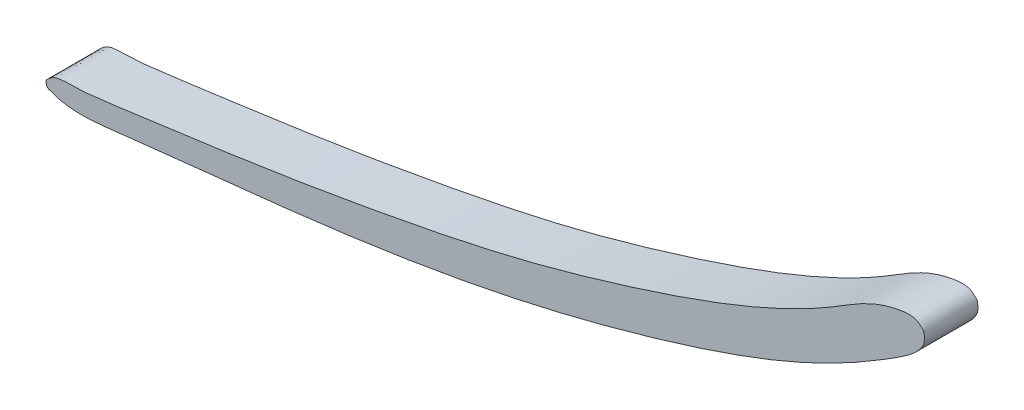
ISO-10303-21;
HEADER;
FILE_DESCRIPTION(('STEP AP214'),'2;1');
FILE_NAME('part.step','',(''),(''),'','','');
FILE_SCHEMA(('AUTOMOTIVE_DESIGN { 1 0 10303 214 1 1 1 1 }'));
ENDSEC;
DATA;
#1=APPLICATION_CONTEXT('core data for automotive mechanical design processes');
#2=APPLICATION_PROTOCOL_DEFINITION('international standard','automotive_design',2000,#1);
#3=PRODUCT_CONTEXT('',#1,'mechanical');
#4=PRODUCT('Part','Part','',(#3));
#5=PRODUCT_RELATED_PRODUCT_CATEGORY('part','',(#4));
#6=PRODUCT_DEFINITION_FORMATION('','',#4);
#7=PRODUCT_DEFINITION_CONTEXT('part definition',#1,'design');
#8=PRODUCT_DEFINITION('design','',#6,#7);
#9=PRODUCT_DEFINITION_SHAPE('','',#8);
#10=(LENGTH_UNIT() NAMED_UNIT(*) SI_UNIT(.MILLI.,.METRE.));
#11=(NAMED_UNIT(*) PLANE_ANGLE_UNIT() SI_UNIT($,.RADIAN.));
#12=(NAMED_UNIT(*) SI_UNIT($,.STERADIAN.) SOLID_ANGLE_UNIT());
#13=UNCERTAINTY_MEASURE_WITH_UNIT(LENGTH_MEASURE(1.E-05),#10,'distance_accuracy_value','');
#14=(GEOMETRIC_REPRESENTATION_CONTEXT(3) GLOBAL_UNCERTAINTY_ASSIGNED_CONTEXT((#13)) GLOBAL_UNIT_ASSIGNED_CONTEXT((#10,
#11,#12)) REPRESENTATION_CONTEXT('',''));
#15=CARTESIAN_POINT('',(0.,0.,0.));
#16=DIRECTION('',(0.,0.,1.));
#17=DIRECTION('',(1.,0.,0.));
#18=AXIS2_PLACEMENT_3D('',#15,#16,#17);
#19=CARTESIAN_POINT('',(78.7319450195708,0.,332.));
#20=CARTESIAN_POINT('',(78.698592924395,0.0862961726355242,332.));
#21=CARTESIAN_POINT('',(78.6360279586941,0.154236271967225,332.));
#22=CARTESIAN_POINT('',(78.505947181583,0.282207246280975,332.));
#23=CARTESIAN_POINT('',(78.4371830752917,0.342145123711174,332.));
#24=CARTESIAN_POINT('',(78.2345743351538,0.525962735406238,332.));
#25=CARTESIAN_POINT('',(78.1002322713559,0.650880233318252,332.));
#26=CARTESIAN_POINT('',(77.8813767344495,0.811903280749025,332.));
#27=CARTESIAN_POINT('',(77.8060034391002,0.861615265914912,332.));
#28=CARTESIAN_POINT('',(77.6463740732828,0.946503816432809,332.));
#29=CARTESIAN_POINT('',(77.5616973632142,0.982235446058503,332.));
#30=CARTESIAN_POINT('',(77.3009768082406,1.06979566784857,332.));
#31=CARTESIAN_POINT('',(77.1226144195656,1.10143248763723,332.));
#32=CARTESIAN_POINT('',(76.7614522103238,1.13862340118952,332.));
#33=CARTESIAN_POINT('',(76.5781212676885,1.14341343368627,332.));
#34=CARTESIAN_POINT('',(76.2155234059892,1.13929984730761,332.));
#35=CARTESIAN_POINT('',(76.0351729109473,1.13005067001033,332.));
#36=CARTESIAN_POINT('',(75.4966709169138,1.08296928434782,332.));
#37=CARTESIAN_POINT('',(75.1408742620453,1.02727931132441,332.));
#38=CARTESIAN_POINT('',(74.0780947419602,0.825246469483427,332.));
#39=CARTESIAN_POINT('',(73.3753749094688,0.638425038379013,332.));
#40=CARTESIAN_POINT('',(72.0113611039975,0.194251143162508,332.));
#41=CARTESIAN_POINT('',(71.3465255762792,-0.0665994178270982,332.));
#42=CARTESIAN_POINT('',(69.4022336988609,-0.962508559779454,332.));
#43=CARTESIAN_POINT('',(68.1686561192179,-1.70123520839468,332.));
#44=CARTESIAN_POINT('',(66.3270541886306,-2.82873293397266,332.));
#45=CARTESIAN_POINT('',(65.7140969273548,-3.20659206641776,332.));
#46=CARTESIAN_POINT('',(64.4815176145269,-3.94746873458233,332.));
#47=CARTESIAN_POINT('',(63.8625001466097,-4.31183259721172,332.));
#48=CARTESIAN_POINT('',(61.9904140490585,-5.37144615932192,332.));
#49=CARTESIAN_POINT('',(60.7227402165332,-6.03417202498053,332.));
#50=CARTESIAN_POINT('',(58.161854870259,-7.30275475512636,332.));
#51=CARTESIAN_POINT('',(56.8687725271582,-7.90889926537447,332.));
#52=CARTESIAN_POINT('',(54.2638320409681,-9.07937709000703,332.));
#53=CARTESIAN_POINT('',(52.9515375342118,-9.6427386808562,332.));
#54=CARTESIAN_POINT('',(50.3072754416256,-10.7256525461531,332.));
#55=CARTESIAN_POINT('',(48.9756382530983,-11.2459405712132,332.));
#56=CARTESIAN_POINT('',(44.9586602219631,-12.7576655783465,332.));
#57=CARTESIAN_POINT('',(42.2515285705043,-13.7014353645812,332.));
#58=CARTESIAN_POINT('',(36.8044857123461,-15.5124423138328,332.));
#59=CARTESIAN_POINT('',(34.0671229755587,-16.3757109911532,332.));
#60=CARTESIAN_POINT('',(28.5711706955289,-18.0306425171144,332.));
#61=CARTESIAN_POINT('',(25.813644780726,-18.823744710811,332.));
#62=CARTESIAN_POINT('',(20.2725486245057,-20.3162321214219,332.));
#63=CARTESIAN_POINT('',(17.4877869658497,-21.0149126647981,332.));
#64=CARTESIAN_POINT('',(11.8965223326884,-22.3092605239586,332.));
#65=CARTESIAN_POINT('',(9.09018813441748,-22.907110872046,332.));
#66=CARTESIAN_POINT('',(3.46422329984577,-24.0415300138458,332.));
#67=CARTESIAN_POINT('',(0.644735344651545,-24.5787880267674,332.));
#68=CARTESIAN_POINT('',(-4.9996227121521,-25.6196102546238,332.));
#69=CARTESIAN_POINT('',(-7.82527413212353,-26.1207998463998,332.));
#70=CARTESIAN_POINT('',(-13.4847421317255,-27.0779805567612,332.));
#71=CARTESIAN_POINT('',(-16.318465361412,-27.532360075278,332.));
#72=CARTESIAN_POINT('',(-21.9924902792767,-28.3963919981597,332.));
#73=CARTESIAN_POINT('',(-24.8328013856425,-28.8070055274834,332.));
#74=CARTESIAN_POINT('',(-30.5169156303883,-29.6045967422998,332.));
#75=CARTESIAN_POINT('',(-33.3602982576042,-29.9939013469119,332.));
#76=CARTESIAN_POINT('',(-37.626094764206,-30.5724554997542,332.));
#77=CARTESIAN_POINT('',(-39.0481332553724,-30.7645420230119,332.));
#78=CARTESIAN_POINT('',(-41.1820413064443,-31.0462533449841,332.));
#79=CARTESIAN_POINT('',(-41.8934772201922,-31.1391704658693,332.));
#80=CARTESIAN_POINT('',(-43.3165424623874,-31.3234264120956,332.));
#81=CARTESIAN_POINT('',(-44.0278968804641,-31.4169902091609,332.));
#82=CARTESIAN_POINT('',(-45.452982053534,-31.5849710938434,332.));
#83=CARTESIAN_POINT('',(-46.1671208971953,-31.6571820272252,332.));
#84=CARTESIAN_POINT('',(-47.2398259235487,-31.7308019727612,332.));
#85=CARTESIAN_POINT('',(-47.5976940412823,-31.7499256941533,332.));
#86=CARTESIAN_POINT('',(-48.3141062699283,-31.7759594846969,332.));
#87=CARTESIAN_POINT('',(-48.6727881808851,-31.78037982189,332.));
#88=CARTESIAN_POINT('',(-49.3897182017619,-31.7970582898689,332.));
#89=CARTESIAN_POINT('',(-49.7479114362279,-31.8108837347834,332.));
#90=CARTESIAN_POINT('',(-50.4582817055487,-31.8798119488284,332.));
#91=CARTESIAN_POINT('',(-50.8111044326501,-31.9315127683302,332.));
#92=CARTESIAN_POINT('',(-51.327525452678,-32.1025513442067,332.));
#93=CARTESIAN_POINT('',(-51.492473237249,-32.1750178008977,332.));
#94=CARTESIAN_POINT('',(-51.8010526664991,-32.3556658260121,332.));
#95=CARTESIAN_POINT('',(-51.9473616764412,-32.4612172239568,332.));
#96=CARTESIAN_POINT('',(-52.1577943280416,-32.6324854893259,332.));
#97=CARTESIAN_POINT('',(-52.2269957264221,-32.6907028770524,332.));
#98=CARTESIAN_POINT('',(-52.3627040876062,-32.810361210931,332.));
#99=CARTESIAN_POINT('',(-52.42917039923,-32.8715125446625,332.));
#100=CARTESIAN_POINT('',(-52.5129486427516,-32.9771822301,332.));
#101=CARTESIAN_POINT('',(-52.5382150952655,-33.0159916562963,332.));
#102=CARTESIAN_POINT('',(-52.5742038564087,-33.1002646333232,332.));
#103=CARTESIAN_POINT('',(-52.5840826913572,-33.1453364060187,332.));
#104=CARTESIAN_POINT('',(-52.5953809556758,-33.2827418290005,332.));
#105=CARTESIAN_POINT('',(-52.5800353420809,-33.3737946179991,332.));
#106=CARTESIAN_POINT('',(-52.5404365745839,-33.5523293866487,332.));
#107=CARTESIAN_POINT('',(-52.5158965476891,-33.6402154355629,332.));
#108=CARTESIAN_POINT('',(-52.46345501915,-33.7674897834462,332.));
#109=CARTESIAN_POINT('',(-52.4429882515677,-33.8089010992169,332.));
#110=CARTESIAN_POINT('',(-52.3921000333844,-33.8845646112999,332.));
#111=CARTESIAN_POINT('',(-52.3608153467589,-33.9195226952143,332.));
#112=CARTESIAN_POINT('',(-52.2555404759611,-34.006496080695,332.));
#113=CARTESIAN_POINT('',(-52.1673330062429,-34.0394227619844,332.));
#114=CARTESIAN_POINT('',(-51.9923830180372,-34.0941747173135,332.));
#115=CARTESIAN_POINT('',(-51.9041205444647,-34.119163644491,332.));
#116=CARTESIAN_POINT('',(-51.4672856641689,-34.2576806835825,332.));
#117=CARTESIAN_POINT('',(-51.1261572067783,-34.3976626279226,332.));
#118=CARTESIAN_POINT('',(-50.4246158367771,-34.6000952201043,332.));
#119=CARTESIAN_POINT('',(-50.066539375179,-34.6698350095753,332.));
#120=CARTESIAN_POINT('',(-49.3432358356563,-34.7785065807542,332.));
#121=CARTESIAN_POINT('',(-48.9770860612718,-34.8182148389236,332.));
#122=CARTESIAN_POINT('',(-47.1536933302241,-34.9579654487765,332.));
#123=CARTESIAN_POINT('',(-45.7063411553669,-34.8680509132502,332.));
#124=CARTESIAN_POINT('',(-43.5389774140063,-34.6681211734338,332.));
#125=CARTESIAN_POINT('',(-42.8172626355373,-34.5883438796928,332.));
#126=CARTESIAN_POINT('',(-41.3741691079069,-34.4228236083458,332.));
#127=CARTESIAN_POINT('',(-40.6528279228595,-34.3362707913582,332.));
#128=CARTESIAN_POINT('',(-38.4888802314072,-34.0766286492981,332.));
#129=CARTESIAN_POINT('',(-37.0459873678075,-33.9058183576239,332.));
#130=CARTESIAN_POINT('',(-32.714679181275,-33.4163975868789,332.));
#131=CARTESIAN_POINT('',(-29.8240776067787,-33.1170411014198,332.));
#132=CARTESIAN_POINT('',(-24.0433605336826,-32.5147424168514,332.));
#133=CARTESIAN_POINT('',(-21.1533089995997,-32.2107485584869,332.));
#134=CARTESIAN_POINT('',(-15.3777463894629,-31.5606914535981,332.));
#135=CARTESIAN_POINT('',(-12.4920294192304,-31.2161509726856,332.));
#136=CARTESIAN_POINT('',(-6.72892766000135,-30.4689772710302,332.));
#137=CARTESIAN_POINT('',(-3.85141469354719,-30.0658451742263,332.));
#138=CARTESIAN_POINT('',(4.76751949890646,-28.7569037979998,332.));
#139=CARTESIAN_POINT('',(10.4913150536816,-27.7471518071119,332.));
#140=CARTESIAN_POINT('',(21.8700769819089,-25.3730394373233,332.));
#141=CARTESIAN_POINT('',(27.5188285353269,-24.0043939278672,332.));
#142=CARTESIAN_POINT('',(35.9277061778924,-21.7033455107847,332.));
#143=CARTESIAN_POINT('',(38.7190720568369,-20.8946545547805,332.));
#144=CARTESIAN_POINT('',(44.2726305012966,-19.1882793343087,332.));
#145=CARTESIAN_POINT('',(47.035468418779,-18.29060789712,332.));
#146=CARTESIAN_POINT('',(52.519793857239,-16.3633244392833,332.));
#147=CARTESIAN_POINT('',(55.2379906738963,-15.3348106274954,332.));
#148=CARTESIAN_POINT('',(60.5943457738799,-13.0812998994576,332.));
#149=CARTESIAN_POINT('',(63.2323765300433,-11.8541412724745,332.));
#150=CARTESIAN_POINT('',(68.3892883800688,-9.17053763751624,332.));
#151=CARTESIAN_POINT('',(70.909693606343,-7.71590273622422,332.));
#152=CARTESIAN_POINT('',(73.9927741895663,-5.79149360063517,332.));
#153=CARTESIAN_POINT('',(74.606322830112,-5.40133469653858,332.));
#154=CARTESIAN_POINT('',(75.5133096111987,-4.79647289076586,332.));
#155=CARTESIAN_POINT('',(75.812917316275,-4.5908057392047,332.));
#156=CARTESIAN_POINT('',(76.4027355738621,-4.16549755046525,332.));
#157=CARTESIAN_POINT('',(76.6929002296196,-3.94704493033955,332.));
#158=CARTESIAN_POINT('',(77.2512976905918,-3.4854968041577,332.));
#159=CARTESIAN_POINT('',(77.5196053225075,-3.24230223222017,332.));
#160=CARTESIAN_POINT('',(78.0181310575056,-2.71247474034212,332.));
#161=CARTESIAN_POINT('',(78.2461861907169,-2.42463389558798,332.));
#162=CARTESIAN_POINT('',(78.5282337647369,-1.95796453751743,332.));
#163=CARTESIAN_POINT('',(78.6138935827237,-1.79460321394992,332.));
#164=CARTESIAN_POINT('',(78.7480296997088,-1.45612442338281,332.));
#165=CARTESIAN_POINT('',(78.7976285856701,-1.28194848524909,332.));
#166=CARTESIAN_POINT('',(78.830070167335,-0.914732247024508,332.));
#167=CARTESIAN_POINT('',(78.8080201696052,-0.730244943368698,332.));
#168=CARTESIAN_POINT('',(78.7797829219355,-0.455439766634505,332.));
#169=CARTESIAN_POINT('',(78.7743791838306,-0.363604698540503,332.));
#170=CARTESIAN_POINT('',(78.7659416187101,-0.179796611375714,332.));
#171=CARTESIAN_POINT('',(78.7652971147467,-0.0862961726355097,332.));
#172=CARTESIAN_POINT('',(78.7319450195708,0.,332.));
#173=B_SPLINE_CURVE_WITH_KNOTS('',3,(#19,#20,#21,#22,#23,#24,#25,#26,#27,#28,#29,#30,#31,#32,
#33,#34,#35,#36,#37,#38,#39,#40,#41,#42,#43,#44,#45,#46,#47,#48,#49,#50,#51,#52,#53,#54,#55,#56,
#57,#58,#59,#60,#61,#62,#63,#64,#65,#66,#67,#68,#69,#70,#71,#72,#73,#74,#75,#76,#77,#78,#79,#80,
#81,#82,#83,#84,#85,#86,#87,#88,#89,#90,#91,#92,#93,#94,#95,#96,#97,#98,#99,#100,#101,#102,#103,
#104,#105,#106,#107,#108,#109,#110,#111,#112,#113,#114,#115,#116,#117,#118,#119,#120,#121,#122,
#123,#124,#125,#126,#127,#128,#129,#130,#131,#132,#133,#134,#135,#136,#137,#138,#139,#140,#141,
#142,#143,#144,#145,#146,#147,#148,#149,#150,#151,#152,#153,#154,#155,#156,#157,#158,#159,#160,
#161,#162,#163,#164,#165,#166,#167,#168,#169,#170,#171,#172),.UNSPECIFIED.,.T.,.F.,(4,2,2,2,2,2,
2,2,2,2,2,2,2,2,2,2,2,2,2,2,2,2,2,2,2,2,2,2,2,2,2,2,2,2,2,2,2,2,2,2,2,2,2,2,2,2,2,2,2,2,2,2,2,2,
2,2,2,2,2,2,2,2,2,2,2,2,2,2,2,2,2,2,2,2,2,2,4),(0.,0.000976562499999942,0.00195312499999988,
0.00390624999999977,0.00488281249999977,0.00585937499999977,0.00781249999999977,
0.00976562499999978,0.0117187499999998,0.0156249999999996,0.0234374999999995,0.0312499999999994,
0.0468749999999991,0.054687499999999,0.0624999999999989,0.0781249999999989,0.0937499999999989,
0.109374999999999,0.124999999999999,0.156249999999999,0.187499999999999,0.218749999999999,
0.249999999999999,0.281249999999999,0.312499999999999,0.343749999999999,0.374999999999999,
0.406249999999999,0.437499999999999,0.453124999999999,0.460937499999999,0.468749999999999,
0.476562499999999,0.480468749999999,0.484375,0.48828125,0.4921875,0.494140625,0.49609375,
0.4970703125,0.498046875,0.49853515625,0.4990234375,0.5,0.5009765625,0.50146484375,0.501953125,
0.5029296875,0.50390625,0.5078125,0.51171875,0.515625,0.53125,0.5390625,0.546875,0.5625,0.59375,
0.625,0.65625,0.6875,0.75,0.8125,0.84375,0.875,0.90625,0.9375,0.96875,0.9765625,0.98046875,
0.984375,0.98828125,0.9921875,0.994140625,0.99609375,0.998046875,0.9990234375,1.),.UNSPECIFIED.);
#174=DIRECTION('',(0.,0.,-1.));
#175=VECTOR('',#174,1.);
#176=SURFACE_OF_LINEAR_EXTRUSION('',#173,#175);
#177=CARTESIAN_POINT('',(78.7319450195708,0.,332.));
#178=CARTESIAN_POINT('',(78.7652971147467,-0.0862961726355097,332.));
#179=CARTESIAN_POINT('',(78.7659416187101,-0.179796611375714,332.));
#180=CARTESIAN_POINT('',(78.7743791838306,-0.363604698540503,332.));
#181=CARTESIAN_POINT('',(78.7797829219355,-0.455439766634505,332.));
#182=CARTESIAN_POINT('',(78.8080201696052,-0.730244943368698,332.));
#183=CARTESIAN_POINT('',(78.830070167335,-0.914732247024508,332.));
#184=CARTESIAN_POINT('',(78.7976285856701,-1.28194848524909,332.));
#185=CARTESIAN_POINT('',(78.7480296997088,-1.45612442338281,332.));
#186=CARTESIAN_POINT('',(78.6138935827237,-1.79460321394992,332.));
#187=CARTESIAN_POINT('',(78.5282337647369,-1.95796453751743,332.));
#188=CARTESIAN_POINT('',(78.2461861907169,-2.42463389558798,332.));
#189=CARTESIAN_POINT('',(78.0181310575056,-2.71247474034212,332.));
#190=CARTESIAN_POINT('',(77.5196053225075,-3.24230223222017,332.));
#191=CARTESIAN_POINT('',(77.2512976905918,-3.4854968041577,332.));
#192=CARTESIAN_POINT('',(76.6929002296196,-3.94704493033955,332.));
#193=CARTESIAN_POINT('',(76.4027355738621,-4.16549755046525,332.));
#194=CARTESIAN_POINT('',(75.812917316275,-4.5908057392047,332.));
#195=CARTESIAN_POINT('',(75.5133096111987,-4.79647289076586,332.));
#196=CARTESIAN_POINT('',(74.606322830112,-5.40133469653858,332.));
#197=CARTESIAN_POINT('',(73.9927741895663,-5.79149360063517,332.));
#198=CARTESIAN_POINT('',(70.909693606343,-7.71590273622422,332.));
#199=CARTESIAN_POINT('',(68.3892883800688,-9.17053763751624,332.));
#200=CARTESIAN_POINT('',(63.2323765300433,-11.8541412724745,332.));
#201=CARTESIAN_POINT('',(60.5943457738799,-13.0812998994576,332.));
#202=CARTESIAN_POINT('',(55.2379906738963,-15.3348106274954,332.));
#203=CARTESIAN_POINT('',(52.519793857239,-16.3633244392833,332.));
#204=CARTESIAN_POINT('',(47.035468418779,-18.29060789712,332.));
#205=CARTESIAN_POINT('',(44.2726305012966,-19.1882793343087,332.));
#206=CARTESIAN_POINT('',(38.7190720568369,-20.8946545547805,332.));
#207=CARTESIAN_POINT('',(35.9277061778924,-21.7033455107847,332.));
#208=CARTESIAN_POINT('',(27.5188285353269,-24.0043939278672,332.));
#209=CARTESIAN_POINT('',(21.8700769819089,-25.3730394373233,332.));
#210=CARTESIAN_POINT('',(10.4913150536816,-27.7471518071119,332.));
#211=CARTESIAN_POINT('',(4.76751949890646,-28.7569037979998,332.));
#212=CARTESIAN_POINT('',(-3.85141469354719,-30.0658451742263,332.));
#213=CARTESIAN_POINT('',(-6.72892766000135,-30.4689772710302,332.));
#214=CARTESIAN_POINT('',(-12.4920294192304,-31.2161509726856,332.));
#215=CARTESIAN_POINT('',(-15.3777463894629,-31.5606914535981,332.));
#216=CARTESIAN_POINT('',(-21.1533089995997,-32.2107485584869,332.));
#217=CARTESIAN_POINT('',(-24.0433605336826,-32.5147424168514,332.));
#218=CARTESIAN_POINT('',(-29.8240776067787,-33.1170411014198,332.));
#219=CARTESIAN_POINT('',(-32.714679181275,-33.4163975868789,332.));
#220=CARTESIAN_POINT('',(-37.0459873678075,-33.9058183576239,332.));
#221=CARTESIAN_POINT('',(-38.4888802314072,-34.0766286492981,332.));
#222=CARTESIAN_POINT('',(-40.6528279228595,-34.3362707913582,332.));
#223=CARTESIAN_POINT('',(-41.3741691079069,-34.4228236083458,332.));
#224=CARTESIAN_POINT('',(-42.8172626355373,-34.5883438796928,332.));
#225=CARTESIAN_POINT('',(-43.5389774140063,-34.6681211734338,332.));
#226=CARTESIAN_POINT('',(-45.7063411553669,-34.8680509132502,332.));
#227=CARTESIAN_POINT('',(-47.1536933302241,-34.9579654487765,332.));
#228=CARTESIAN_POINT('',(-48.9770860612718,-34.8182148389236,332.));
#229=CARTESIAN_POINT('',(-49.3432358356563,-34.7785065807542,332.));
#230=CARTESIAN_POINT('',(-50.066539375179,-34.6698350095753,332.));
#231=CARTESIAN_POINT('',(-50.4246158367771,-34.6000952201043,332.));
#232=CARTESIAN_POINT('',(-51.1261572067783,-34.3976626279226,332.));
#233=CARTESIAN_POINT('',(-51.4672856641689,-34.2576806835825,332.));
#234=CARTESIAN_POINT('',(-51.9041205444647,-34.119163644491,332.));
#235=CARTESIAN_POINT('',(-51.9923830180372,-34.0941747173135,332.));
#236=CARTESIAN_POINT('',(-52.1673330062429,-34.0394227619844,332.));
#237=CARTESIAN_POINT('',(-52.2555404759611,-34.006496080695,332.));
#238=CARTESIAN_POINT('',(-52.3608153467589,-33.9195226952143,332.));
#239=CARTESIAN_POINT('',(-52.3921000333844,-33.8845646112999,332.));
#240=CARTESIAN_POINT('',(-52.4429882515677,-33.8089010992169,332.));
#241=CARTESIAN_POINT('',(-52.46345501915,-33.7674897834462,332.));
#242=CARTESIAN_POINT('',(-52.5158965476891,-33.6402154355629,332.));
#243=CARTESIAN_POINT('',(-52.5404365745839,-33.5523293866487,332.));
#244=CARTESIAN_POINT('',(-52.5800353420809,-33.3737946179991,332.));
#245=CARTESIAN_POINT('',(-52.5953809556758,-33.2827418290005,332.));
#246=CARTESIAN_POINT('',(-52.5840826913572,-33.1453364060187,332.));
#247=CARTESIAN_POINT('',(-52.5742038564087,-33.1002646333232,332.));
#248=CARTESIAN_POINT('',(-52.5382150952655,-33.0159916562963,332.));
#249=CARTESIAN_POINT('',(-52.5129486427516,-32.9771822301,332.));
#250=CARTESIAN_POINT('',(-52.42917039923,-32.8715125446625,332.));
#251=CARTESIAN_POINT('',(-52.3627040876062,-32.810361210931,332.));
#252=CARTESIAN_POINT('',(-52.2269957264221,-32.6907028770524,332.));
#253=CARTESIAN_POINT('',(-52.1577943280416,-32.6324854893259,332.));
#254=CARTESIAN_POINT('',(-51.9473616764412,-32.4612172239568,332.));
#255=CARTESIAN_POINT('',(-51.8010526664991,-32.3556658260121,332.));
#256=CARTESIAN_POINT('',(-51.492473237249,-32.1750178008977,332.));
#257=CARTESIAN_POINT('',(-51.327525452678,-32.1025513442067,332.));
#258=CARTESIAN_POINT('',(-50.8111044326501,-31.9315127683302,332.));
#259=CARTESIAN_POINT('',(-50.4582817055487,-31.8798119488284,332.));
#260=CARTESIAN_POINT('',(-49.7479114362279,-31.8108837347834,332.));
#261=CARTESIAN_POINT('',(-49.3897182017619,-31.7970582898689,332.));
#262=CARTESIAN_POINT('',(-48.6727881808851,-31.78037982189,332.));
#263=CARTESIAN_POINT('',(-48.3141062699283,-31.7759594846969,332.));
#264=CARTESIAN_POINT('',(-47.5976940412823,-31.7499256941533,332.));
#265=CARTESIAN_POINT('',(-47.2398259235487,-31.7308019727612,332.));
#266=CARTESIAN_POINT('',(-46.1671208971953,-31.6571820272252,332.));
#267=CARTESIAN_POINT('',(-45.452982053534,-31.5849710938434,332.));
#268=CARTESIAN_POINT('',(-44.0278968804641,-31.4169902091609,332.));
#269=CARTESIAN_POINT('',(-43.3165424623874,-31.3234264120956,332.));
#270=CARTESIAN_POINT('',(-41.8934772201922,-31.1391704658693,332.));
#271=CARTESIAN_POINT('',(-41.1820413064443,-31.0462533449841,332.));
#272=CARTESIAN_POINT('',(-39.0481332553724,-30.7645420230119,332.));
#273=CARTESIAN_POINT('',(-37.626094764206,-30.5724554997542,332.));
#274=CARTESIAN_POINT('',(-33.3602982576042,-29.9939013469119,332.));
#275=CARTESIAN_POINT('',(-30.5169156303883,-29.6045967422998,332.));
#276=CARTESIAN_POINT('',(-24.8328013856425,-28.8070055274834,332.));
#277=CARTESIAN_POINT('',(-21.9924902792767,-28.3963919981597,332.));
#278=CARTESIAN_POINT('',(-16.318465361412,-27.532360075278,332.));
#279=CARTESIAN_POINT('',(-13.4847421317255,-27.0779805567612,332.));
#280=CARTESIAN_POINT('',(-7.82527413212353,-26.1207998463998,332.));
#281=CARTESIAN_POINT('',(-4.9996227121521,-25.6196102546238,332.));
#282=CARTESIAN_POINT('',(0.644735344651545,-24.5787880267674,332.));
#283=CARTESIAN_POINT('',(3.46422329984577,-24.0415300138458,332.));
#284=CARTESIAN_POINT('',(9.09018813441748,-22.907110872046,332.));
#285=CARTESIAN_POINT('',(11.8965223326884,-22.3092605239586,332.));
#286=CARTESIAN_POINT('',(17.4877869658497,-21.0149126647981,332.));
#287=CARTESIAN_POINT('',(20.2725486245057,-20.3162321214219,332.));
#288=CARTESIAN_POINT('',(25.813644780726,-18.823744710811,332.));
#289=CARTESIAN_POINT('',(28.5711706955289,-18.0306425171144,332.));
#290=CARTESIAN_POINT('',(34.0671229755587,-16.3757109911532,332.));
#291=CARTESIAN_POINT('',(36.8044857123461,-15.5124423138328,332.));
#292=CARTESIAN_POINT('',(42.2515285705043,-13.7014353645812,332.));
#293=CARTESIAN_POINT('',(44.9586602219631,-12.7576655783465,332.));
#294=CARTESIAN_POINT('',(48.9756382530983,-11.2459405712132,332.));
#295=CARTESIAN_POINT('',(50.3072754416256,-10.7256525461531,332.));
#296=CARTESIAN_POINT('',(52.9515375342118,-9.6427386808562,332.));
#297=CARTESIAN_POINT('',(54.2638320409681,-9.07937709000703,332.));
#298=CARTESIAN_POINT('',(56.8687725271582,-7.90889926537447,332.));
#299=CARTESIAN_POINT('',(58.161854870259,-7.30275475512636,332.));
#300=CARTESIAN_POINT('',(60.7227402165332,-6.03417202498053,332.));
#301=CARTESIAN_POINT('',(61.9904140490585,-5.37144615932192,332.));
#302=CARTESIAN_POINT('',(63.8625001466097,-4.31183259721172,332.));
#303=CARTESIAN_POINT('',(64.4815176145269,-3.94746873458233,332.));
#304=CARTESIAN_POINT('',(65.7140969273548,-3.20659206641776,332.));
#305=CARTESIAN_POINT('',(66.3270541886306,-2.82873293397266,332.));
#306=CARTESIAN_POINT('',(68.1686561192179,-1.70123520839468,332.));
#307=CARTESIAN_POINT('',(69.4022336988609,-0.962508559779454,332.));
#308=CARTESIAN_POINT('',(71.3465255762792,-0.0665994178270982,332.));
#309=CARTESIAN_POINT('',(72.0113611039975,0.194251143162508,332.));
#310=CARTESIAN_POINT('',(73.3753749094688,0.638425038379013,332.));
#311=CARTESIAN_POINT('',(74.0780947419602,0.825246469483427,332.));
#312=CARTESIAN_POINT('',(75.1408742620453,1.02727931132441,332.));
#313=CARTESIAN_POINT('',(75.4966709169138,1.08296928434782,332.));
#314=CARTESIAN_POINT('',(76.0351729109473,1.13005067001033,332.));
#315=CARTESIAN_POINT('',(76.2155234059892,1.13929984730761,332.));
#316=CARTESIAN_POINT('',(76.5781212676885,1.14341343368627,332.));
#317=CARTESIAN_POINT('',(76.7614522103238,1.13862340118952,332.));
#318=CARTESIAN_POINT('',(77.1226144195656,1.10143248763723,332.));
#319=CARTESIAN_POINT('',(77.3009768082406,1.06979566784857,332.));
#320=CARTESIAN_POINT('',(77.5616973632142,0.982235446058503,332.));
#321=CARTESIAN_POINT('',(77.6463740732828,0.946503816432809,332.));
#322=CARTESIAN_POINT('',(77.8060034391002,0.861615265914912,332.));
#323=CARTESIAN_POINT('',(77.8813767344495,0.811903280749025,332.));
#324=CARTESIAN_POINT('',(78.1002322713559,0.650880233318252,332.));
#325=CARTESIAN_POINT('',(78.2345743351538,0.525962735406238,332.));
#326=CARTESIAN_POINT('',(78.4371830752917,0.342145123711174,332.));
#327=CARTESIAN_POINT('',(78.505947181583,0.282207246280975,332.));
#328=CARTESIAN_POINT('',(78.6360279586941,0.154236271967225,332.));
#329=CARTESIAN_POINT('',(78.698592924395,0.0862961726355242,332.));
#330=CARTESIAN_POINT('',(78.7319450195708,0.,332.));
#331=B_SPLINE_CURVE_WITH_KNOTS('',3,(#177,#178,#179,#180,#181,#182,#183,#184,#185,#186,#187,
#188,#189,#190,#191,#192,#193,#194,#195,#196,#197,#198,#199,#200,#201,#202,#203,#204,#205,#206,
#207,#208,#209,#210,#211,#212,#213,#214,#215,#216,#217,#218,#219,#220,#221,#222,#223,#224,#225,
#226,#227,#228,#229,#230,#231,#232,#233,#234,#235,#236,#237,#238,#239,#240,#241,#242,#243,#244,
#245,#246,#247,#248,#249,#250,#251,#252,#253,#254,#255,#256,#257,#258,#259,#260,#261,#262,#263,
#264,#265,#266,#267,#268,#269,#270,#271,#272,#273,#274,#275,#276,#277,#278,#279,#280,#281,#282,
#283,#284,#285,#286,#287,#288,#289,#290,#291,#292,#293,#294,#295,#296,#297,#298,#299,#300,#301,
#302,#303,#304,#305,#306,#307,#308,#309,#310,#311,#312,#313,#314,#315,#316,#317,#318,#319,#320,
#321,#322,#323,#324,#325,#326,#327,#328,#329,#330),.UNSPECIFIED.,.T.,.F.,(4,2,2,2,2,2,2,2,2,2,2,
2,2,2,2,2,2,2,2,2,2,2,2,2,2,2,2,2,2,2,2,2,2,2,2,2,2,2,2,2,2,2,2,2,2,2,2,2,2,2,2,2,2,2,2,2,2,2,2,
2,2,2,2,2,2,2,2,2,2,2,2,2,2,2,2,2,4),(0.,0.000976562499999889,0.00195312499999989,
0.00390624999999989,0.00585937499999989,0.00781249999999989,0.0117187499999999,
0.0156249999999999,0.0195312499999998,0.0234374999999998,0.0312499999999998,0.0624999999999998,
0.0937499999999999,0.125,0.15625,0.1875,0.25,0.3125,0.34375,0.375,0.40625,0.4375,0.453125,
0.4609375,0.46875,0.484375,0.48828125,0.4921875,0.49609375,0.4970703125,0.498046875,
0.49853515625,0.4990234375,0.5,0.5009765625,0.50146484375,0.501953125,0.5029296875,0.50390625,
0.505859375,0.5078125,0.51171875,0.515625,0.519531250000001,0.523437500000001,0.531250000000001,
0.539062500000001,0.546875000000001,0.562500000000001,0.593750000000001,0.625000000000001,
0.656250000000001,0.687500000000001,0.718750000000001,0.750000000000001,0.781250000000001,
0.812500000000001,0.843750000000001,0.875000000000001,0.890625000000001,0.906250000000001,
0.921875000000001,0.937500000000001,0.945312500000001,0.953125000000001,0.968750000000001,
0.9765625,0.984375,0.98828125,0.990234375,0.9921875,0.994140625,0.9951171875,0.99609375,
0.998046875,0.9990234375,1.),.UNSPECIFIED.);
#332=CARTESIAN_POINT('',(78.7319450195708,0.,332.));
#333=VERTEX_POINT('',#332);
#334=EDGE_CURVE('E10',#333,#333,#331,.F.);
#335=ORIENTED_EDGE('',*,*,#334,.F.);
#336=EDGE_LOOP('',(#335));
#337=FACE_BOUND('',#336,.T.);
#338=CARTESIAN_POINT('',(78.7319450195708,0.,324.));
#339=CARTESIAN_POINT('',(78.698592924395,0.0862961726355242,324.));
#340=CARTESIAN_POINT('',(78.6360279586941,0.154236271967225,324.));
#341=CARTESIAN_POINT('',(78.505947181583,0.282207246280975,324.));
#342=CARTESIAN_POINT('',(78.4371830752917,0.342145123711174,324.));
#343=CARTESIAN_POINT('',(78.2345743351538,0.525962735406238,324.));
#344=CARTESIAN_POINT('',(78.1002322713559,0.650880233318252,324.));
#345=CARTESIAN_POINT('',(77.8813767344495,0.811903280749025,324.));
#346=CARTESIAN_POINT('',(77.8060034391002,0.861615265914912,324.));
#347=CARTESIAN_POINT('',(77.6463740732828,0.946503816432809,324.));
#348=CARTESIAN_POINT('',(77.5616973632142,0.982235446058503,324.));
#349=CARTESIAN_POINT('',(77.3009768082406,1.06979566784857,324.));
#350=CARTESIAN_POINT('',(77.1226144195656,1.10143248763723,324.));
#351=CARTESIAN_POINT('',(76.7614522103238,1.13862340118952,324.));
#352=CARTESIAN_POINT('',(76.5781212676885,1.14341343368627,324.));
#353=CARTESIAN_POINT('',(76.2155234059892,1.13929984730761,324.));
#354=CARTESIAN_POINT('',(76.0351729109473,1.13005067001033,324.));
#355=CARTESIAN_POINT('',(75.4966709169138,1.08296928434782,324.));
#356=CARTESIAN_POINT('',(75.1408742620453,1.02727931132441,324.));
#357=CARTESIAN_POINT('',(74.0780947419602,0.825246469483427,324.));
#358=CARTESIAN_POINT('',(73.3753749094688,0.638425038379013,324.));
#359=CARTESIAN_POINT('',(72.0113611039975,0.194251143162508,324.));
#360=CARTESIAN_POINT('',(71.3465255762792,-0.0665994178270982,324.));
#361=CARTESIAN_POINT('',(69.4022336988609,-0.962508559779454,324.));
#362=CARTESIAN_POINT('',(68.1686561192179,-1.70123520839468,324.));
#363=CARTESIAN_POINT('',(66.3270541886306,-2.82873293397266,324.));
#364=CARTESIAN_POINT('',(65.7140969273548,-3.20659206641776,324.));
#365=CARTESIAN_POINT('',(64.4815176145269,-3.94746873458233,324.));
#366=CARTESIAN_POINT('',(63.8625001466097,-4.31183259721172,324.));
#367=CARTESIAN_POINT('',(61.9904140490585,-5.37144615932192,324.));
#368=CARTESIAN_POINT('',(60.7227402165332,-6.03417202498053,324.));
#369=CARTESIAN_POINT('',(58.161854870259,-7.30275475512636,324.));
#370=CARTESIAN_POINT('',(56.8687725271582,-7.90889926537447,324.));
#371=CARTESIAN_POINT('',(54.2638320409681,-9.07937709000703,324.));
#372=CARTESIAN_POINT('',(52.9515375342118,-9.6427386808562,324.));
#373=CARTESIAN_POINT('',(50.3072754416256,-10.7256525461531,324.));
#374=CARTESIAN_POINT('',(48.9756382530983,-11.2459405712132,324.));
#375=CARTESIAN_POINT('',(44.9586602219631,-12.7576655783465,324.));
#376=CARTESIAN_POINT('',(42.2515285705043,-13.7014353645812,324.));
#377=CARTESIAN_POINT('',(36.8044857123461,-15.5124423138328,324.));
#378=CARTESIAN_POINT('',(34.0671229755587,-16.3757109911532,324.));
#379=CARTESIAN_POINT('',(28.5711706955289,-18.0306425171144,324.));
#380=CARTESIAN_POINT('',(25.813644780726,-18.823744710811,324.));
#381=CARTESIAN_POINT('',(20.2725486245057,-20.3162321214219,324.));
#382=CARTESIAN_POINT('',(17.4877869658497,-21.0149126647981,324.));
#383=CARTESIAN_POINT('',(11.8965223326884,-22.3092605239586,324.));
#384=CARTESIAN_POINT('',(9.09018813441748,-22.907110872046,324.));
#385=CARTESIAN_POINT('',(3.46422329984577,-24.0415300138458,324.));
#386=CARTESIAN_POINT('',(0.644735344651545,-24.5787880267674,324.));
#387=CARTESIAN_POINT('',(-4.9996227121521,-25.6196102546238,324.));
#388=CARTESIAN_POINT('',(-7.82527413212353,-26.1207998463998,324.));
#389=CARTESIAN_POINT('',(-13.4847421317255,-27.0779805567612,324.));
#390=CARTESIAN_POINT('',(-16.318465361412,-27.532360075278,324.));
#391=CARTESIAN_POINT('',(-21.9924902792767,-28.3963919981597,324.));
#392=CARTESIAN_POINT('',(-24.8328013856425,-28.8070055274834,324.));
#393=CARTESIAN_POINT('',(-30.5169156303883,-29.6045967422998,324.));
#394=CARTESIAN_POINT('',(-33.3602982576042,-29.9939013469119,324.));
#395=CARTESIAN_POINT('',(-37.626094764206,-30.5724554997542,324.));
#396=CARTESIAN_POINT('',(-39.0481332553724,-30.7645420230119,324.));
#397=CARTESIAN_POINT('',(-41.1820413064443,-31.0462533449841,324.));
#398=CARTESIAN_POINT('',(-41.8934772201922,-31.1391704658693,324.));
#399=CARTESIAN_POINT('',(-43.3165424623874,-31.3234264120956,324.));
#400=CARTESIAN_POINT('',(-44.0278968804641,-31.4169902091609,324.));
#401=CARTESIAN_POINT('',(-45.452982053534,-31.5849710938434,324.));
#402=CARTESIAN_POINT('',(-46.1671208971953,-31.6571820272252,324.));
#403=CARTESIAN_POINT('',(-47.2398259235487,-31.7308019727612,324.));
#404=CARTESIAN_POINT('',(-47.5976940412823,-31.7499256941533,324.));
#405=CARTESIAN_POINT('',(-48.3141062699283,-31.7759594846969,324.));
#406=CARTESIAN_POINT('',(-48.6727881808851,-31.78037982189,324.));
#407=CARTESIAN_POINT('',(-49.3897182017619,-31.7970582898689,324.));
#408=CARTESIAN_POINT('',(-49.7479114362279,-31.8108837347834,324.));
#409=CARTESIAN_POINT('',(-50.4582817055487,-31.8798119488284,324.));
#410=CARTESIAN_POINT('',(-50.8111044326501,-31.9315127683302,324.));
#411=CARTESIAN_POINT('',(-51.327525452678,-32.1025513442067,324.));
#412=CARTESIAN_POINT('',(-51.492473237249,-32.1750178008977,324.));
#413=CARTESIAN_POINT('',(-51.8010526664991,-32.3556658260121,324.));
#414=CARTESIAN_POINT('',(-51.9473616764412,-32.4612172239568,324.));
#415=CARTESIAN_POINT('',(-52.1577943280416,-32.6324854893259,324.));
#416=CARTESIAN_POINT('',(-52.2269957264221,-32.6907028770524,324.));
#417=CARTESIAN_POINT('',(-52.3627040876062,-32.810361210931,324.));
#418=CARTESIAN_POINT('',(-52.42917039923,-32.8715125446625,324.));
#419=CARTESIAN_POINT('',(-52.5129486427516,-32.9771822301,324.));
#420=CARTESIAN_POINT('',(-52.5382150952655,-33.0159916562963,324.));
#421=CARTESIAN_POINT('',(-52.5742038564087,-33.1002646333232,324.));
#422=CARTESIAN_POINT('',(-52.5840826913572,-33.1453364060187,324.));
#423=CARTESIAN_POINT('',(-52.5953809556758,-33.2827418290005,324.));
#424=CARTESIAN_POINT('',(-52.5800353420809,-33.3737946179991,324.));
#425=CARTESIAN_POINT('',(-52.5404365745839,-33.5523293866487,324.));
#426=CARTESIAN_POINT('',(-52.5158965476891,-33.6402154355629,324.));
#427=CARTESIAN_POINT('',(-52.46345501915,-33.7674897834462,324.));
#428=CARTESIAN_POINT('',(-52.4429882515677,-33.8089010992169,324.));
#429=CARTESIAN_POINT('',(-52.3921000333844,-33.8845646112999,324.));
#430=CARTESIAN_POINT('',(-52.3608153467589,-33.9195226952143,324.));
#431=CARTESIAN_POINT('',(-52.2555404759611,-34.006496080695,324.));
#432=CARTESIAN_POINT('',(-52.1673330062429,-34.0394227619844,324.));
#433=CARTESIAN_POINT('',(-51.9923830180372,-34.0941747173135,324.));
#434=CARTESIAN_POINT('',(-51.9041205444647,-34.119163644491,324.));
#435=CARTESIAN_POINT('',(-51.4672856641689,-34.2576806835825,324.));
#436=CARTESIAN_POINT('',(-51.1261572067783,-34.3976626279226,324.));
#437=CARTESIAN_POINT('',(-50.4246158367771,-34.6000952201043,324.));
#438=CARTESIAN_POINT('',(-50.066539375179,-34.6698350095753,324.));
#439=CARTESIAN_POINT('',(-49.3432358356563,-34.7785065807542,324.));
#440=CARTESIAN_POINT('',(-48.9770860612718,-34.8182148389236,324.));
#441=CARTESIAN_POINT('',(-47.1536933302241,-34.9579654487765,324.));
#442=CARTESIAN_POINT('',(-45.7063411553669,-34.8680509132502,324.));
#443=CARTESIAN_POINT('',(-43.5389774140063,-34.6681211734338,324.));
#444=CARTESIAN_POINT('',(-42.8172626355373,-34.5883438796928,324.));
#445=CARTESIAN_POINT('',(-41.3741691079069,-34.4228236083458,324.));
#446=CARTESIAN_POINT('',(-40.6528279228595,-34.3362707913582,324.));
#447=CARTESIAN_POINT('',(-38.4888802314072,-34.0766286492981,324.));
#448=CARTESIAN_POINT('',(-37.0459873678075,-33.9058183576239,324.));
#449=CARTESIAN_POINT('',(-32.714679181275,-33.4163975868789,324.));
#450=CARTESIAN_POINT('',(-29.8240776067787,-33.1170411014198,324.));
#451=CARTESIAN_POINT('',(-24.0433605336826,-32.5147424168514,324.));
#452=CARTESIAN_POINT('',(-21.1533089995997,-32.2107485584869,324.));
#453=CARTESIAN_POINT('',(-15.3777463894629,-31.5606914535981,324.));
#454=CARTESIAN_POINT('',(-12.4920294192304,-31.2161509726856,324.));
#455=CARTESIAN_POINT('',(-6.72892766000135,-30.4689772710302,324.));
#456=CARTESIAN_POINT('',(-3.85141469354719,-30.0658451742263,324.));
#457=CARTESIAN_POINT('',(4.76751949890646,-28.7569037979998,324.));
#458=CARTESIAN_POINT('',(10.4913150536816,-27.7471518071119,324.));
#459=CARTESIAN_POINT('',(21.8700769819089,-25.3730394373233,324.));
#460=CARTESIAN_POINT('',(27.5188285353269,-24.0043939278672,324.));
#461=CARTESIAN_POINT('',(35.9277061778924,-21.7033455107847,324.));
#462=CARTESIAN_POINT('',(38.7190720568369,-20.8946545547805,324.));
#463=CARTESIAN_POINT('',(44.2726305012966,-19.1882793343087,324.));
#464=CARTESIAN_POINT('',(47.035468418779,-18.29060789712,324.));
#465=CARTESIAN_POINT('',(52.519793857239,-16.3633244392833,324.));
#466=CARTESIAN_POINT('',(55.2379906738963,-15.3348106274954,324.));
#467=CARTESIAN_POINT('',(60.5943457738799,-13.0812998994576,324.));
#468=CARTESIAN_POINT('',(63.2323765300433,-11.8541412724745,324.));
#469=CARTESIAN_POINT('',(68.3892883800688,-9.17053763751624,324.));
#470=CARTESIAN_POINT('',(70.909693606343,-7.71590273622422,324.));
#471=CARTESIAN_POINT('',(73.9927741895663,-5.79149360063517,324.));
#472=CARTESIAN_POINT('',(74.606322830112,-5.40133469653858,324.));
#473=CARTESIAN_POINT('',(75.5133096111987,-4.79647289076586,324.));
#474=CARTESIAN_POINT('',(75.812917316275,-4.5908057392047,324.));
#475=CARTESIAN_POINT('',(76.4027355738621,-4.16549755046525,324.));
#476=CARTESIAN_POINT('',(76.6929002296196,-3.94704493033955,324.));
#477=CARTESIAN_POINT('',(77.2512976905918,-3.4854968041577,324.));
#478=CARTESIAN_POINT('',(77.5196053225075,-3.24230223222017,324.));
#479=CARTESIAN_POINT('',(78.0181310575056,-2.71247474034212,324.));
#480=CARTESIAN_POINT('',(78.2461861907169,-2.42463389558798,324.));
#481=CARTESIAN_POINT('',(78.5282337647369,-1.95796453751743,324.));
#482=CARTESIAN_POINT('',(78.6138935827237,-1.79460321394992,324.));
#483=CARTESIAN_POINT('',(78.7480296997088,-1.45612442338281,324.));
#484=CARTESIAN_POINT('',(78.7976285856701,-1.28194848524909,324.));
#485=CARTESIAN_POINT('',(78.830070167335,-0.914732247024508,324.));
#486=CARTESIAN_POINT('',(78.8080201696052,-0.730244943368698,324.));
#487=CARTESIAN_POINT('',(78.7797829219355,-0.455439766634505,324.));
#488=CARTESIAN_POINT('',(78.7743791838306,-0.363604698540503,324.));
#489=CARTESIAN_POINT('',(78.7659416187101,-0.179796611375714,324.));
#490=CARTESIAN_POINT('',(78.7652971147467,-0.0862961726355097,324.));
#491=CARTESIAN_POINT('',(78.7319450195708,0.,324.));
#492=B_SPLINE_CURVE_WITH_KNOTS('',3,(#338,#339,#340,#341,#342,#343,#344,#345,#346,#347,#348,
#349,#350,#351,#352,#353,#354,#355,#356,#357,#358,#359,#360,#361,#362,#363,#364,#365,#366,#367,
#368,#369,#370,#371,#372,#373,#374,#375,#376,#377,#378,#379,#380,#381,#382,#383,#384,#385,#386,
#387,#388,#389,#390,#391,#392,#393,#394,#395,#396,#397,#398,#399,#400,#401,#402,#403,#404,#405,
#406,#407,#408,#409,#410,#411,#412,#413,#414,#415,#416,#417,#418,#419,#420,#421,#422,#423,#424,
#425,#426,#427,#428,#429,#430,#431,#432,#433,#434,#435,#436,#437,#438,#439,#440,#441,#442,#443,
#444,#445,#446,#447,#448,#449,#450,#451,#452,#453,#454,#455,#456,#457,#458,#459,#460,#461,#462,
#463,#464,#465,#466,#467,#468,#469,#470,#471,#472,#473,#474,#475,#476,#477,#478,#479,#480,#481,
#482,#483,#484,#485,#486,#487,#488,#489,#490,#491),.UNSPECIFIED.,.T.,.F.,(4,2,2,2,2,2,2,2,2,2,2,
2,2,2,2,2,2,2,2,2,2,2,2,2,2,2,2,2,2,2,2,2,2,2,2,2,2,2,2,2,2,2,2,2,2,2,2,2,2,2,2,2,2,2,2,2,2,2,2,
2,2,2,2,2,2,2,2,2,2,2,2,2,2,2,2,2,4),(0.,0.000976562499999942,0.00195312499999988,
0.00390624999999977,0.00488281249999977,0.00585937499999977,0.00781249999999977,
0.00976562499999978,0.0117187499999998,0.0156249999999996,0.0234374999999995,0.0312499999999994,
0.0468749999999991,0.054687499999999,0.0624999999999989,0.0781249999999989,0.0937499999999989,
0.109374999999999,0.124999999999999,0.156249999999999,0.187499999999999,0.218749999999999,
0.249999999999999,0.281249999999999,0.312499999999999,0.343749999999999,0.374999999999999,
0.406249999999999,0.437499999999999,0.453124999999999,0.460937499999999,0.468749999999999,
0.476562499999999,0.480468749999999,0.484375,0.48828125,0.4921875,0.494140625,0.49609375,
0.4970703125,0.498046875,0.49853515625,0.4990234375,0.5,0.5009765625,0.50146484375,0.501953125,
0.5029296875,0.50390625,0.5078125,0.51171875,0.515625,0.53125,0.5390625,0.546875,0.5625,0.59375,
0.625,0.65625,0.6875,0.75,0.8125,0.84375,0.875,0.90625,0.9375,0.96875,0.9765625,0.98046875,
0.984375,0.98828125,0.9921875,0.994140625,0.99609375,0.998046875,0.9990234375,1.),.UNSPECIFIED.);
#493=CARTESIAN_POINT('',(78.7319450195708,0.,324.));
#494=VERTEX_POINT('',#493);
#495=EDGE_CURVE('E38',#494,#494,#492,.T.);
#496=ORIENTED_EDGE('',*,*,#495,.T.);
#497=EDGE_LOOP('',(#496));
#498=FACE_BOUND('',#497,.T.);
#499=ADVANCED_FACE('F28',(#337,#498),#176,.F.);
#500=CARTESIAN_POINT('',(-52.5602359583324,-33.463062002324,332.));
#501=DIRECTION('',(0.,0.,-1.));
#502=DIRECTION('',(-1.,0.,0.));
#503=AXIS2_PLACEMENT_3D('',#500,#501,#502);
#504=PLANE('',#503);
#505=ORIENTED_EDGE('',*,*,#334,.T.);
#506=EDGE_LOOP('',(#505));
#507=FACE_BOUND('',#506,.T.);
#508=ADVANCED_FACE('F69',(#507),#504,.F.);
#509=CARTESIAN_POINT('',(-52.5602359583324,-33.463062002324,324.));
#510=DIRECTION('',(0.,0.,-1.));
#511=DIRECTION('',(-1.,0.,0.));
#512=AXIS2_PLACEMENT_3D('',#509,#510,#511);
#513=PLANE('',#512);
#514=ORIENTED_EDGE('',*,*,#495,.F.);
#515=EDGE_LOOP('',(#514));
#516=FACE_BOUND('',#515,.T.);
#517=ADVANCED_FACE('F77',(#516),#513,.T.);
#518=CLOSED_SHELL('',(#499,#508,#517));
#519=MANIFOLD_SOLID_BREP('B2',#518);
#520=ADVANCED_BREP_SHAPE_REPRESENTATION('',(#18,#519),#14);
#521=SHAPE_DEFINITION_REPRESENTATION(#9,#520);
ENDSEC;
END-ISO-10303-21;
